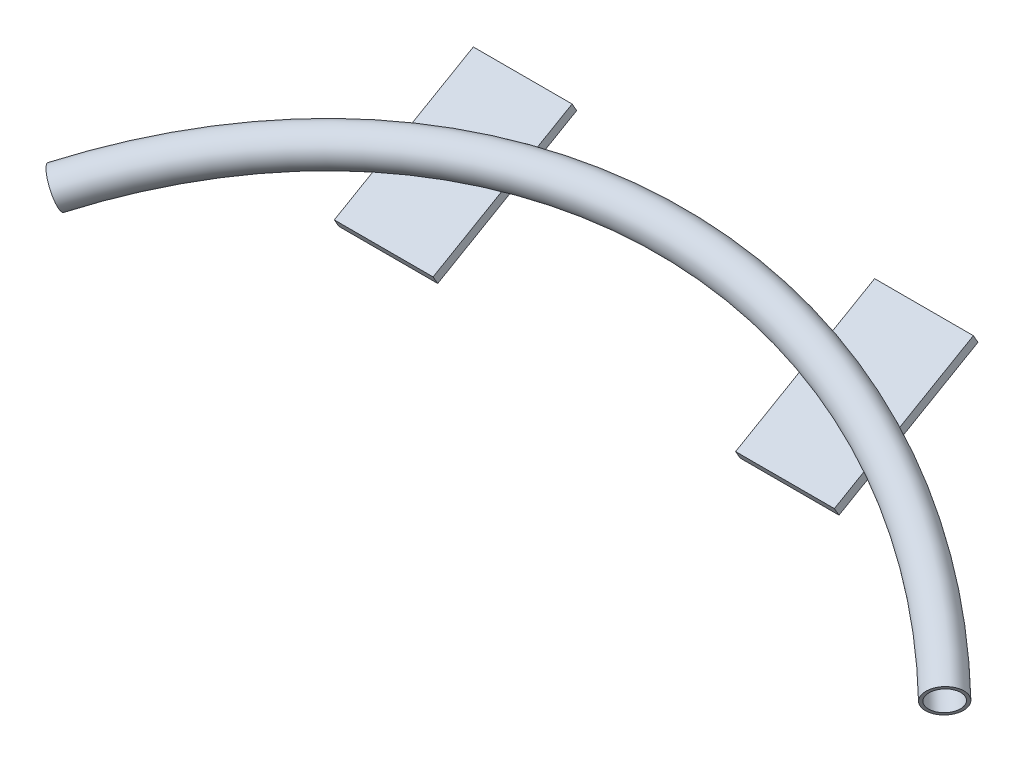
ISO-10303-21;
HEADER;
FILE_DESCRIPTION(('STEP AP214'),'2;1');
FILE_NAME('part.step','',(''),(''),'','','');
FILE_SCHEMA(('AUTOMOTIVE_DESIGN { 1 0 10303 214 1 1 1 1 }'));
ENDSEC;
DATA;
#1=APPLICATION_CONTEXT('core data for automotive mechanical design processes');
#2=APPLICATION_PROTOCOL_DEFINITION('international standard','automotive_design',2000,#1);
#3=PRODUCT_CONTEXT('',#1,'mechanical');
#4=PRODUCT('Part','Part','',(#3));
#5=PRODUCT_RELATED_PRODUCT_CATEGORY('part','',(#4));
#6=PRODUCT_DEFINITION_FORMATION('','',#4);
#7=PRODUCT_DEFINITION_CONTEXT('part definition',#1,'design');
#8=PRODUCT_DEFINITION('design','',#6,#7);
#9=PRODUCT_DEFINITION_SHAPE('','',#8);
#10=(LENGTH_UNIT() NAMED_UNIT(*) SI_UNIT(.MILLI.,.METRE.));
#11=(NAMED_UNIT(*) PLANE_ANGLE_UNIT() SI_UNIT($,.RADIAN.));
#12=(NAMED_UNIT(*) SI_UNIT($,.STERADIAN.) SOLID_ANGLE_UNIT());
#13=UNCERTAINTY_MEASURE_WITH_UNIT(LENGTH_MEASURE(1.E-05),#10,'distance_accuracy_value','');
#14=(GEOMETRIC_REPRESENTATION_CONTEXT(3) GLOBAL_UNCERTAINTY_ASSIGNED_CONTEXT((#13)) GLOBAL_UNIT_ASSIGNED_CONTEXT((#10,
#11,#12)) REPRESENTATION_CONTEXT('',''));
#15=CARTESIAN_POINT('',(0.,0.,0.));
#16=DIRECTION('',(0.,0.,1.));
#17=DIRECTION('',(1.,0.,0.));
#18=AXIS2_PLACEMENT_3D('',#15,#16,#17);
#19=CARTESIAN_POINT('',(155.575,19.7033240868596,-91.2771583964365));
#20=DIRECTION('',(1.,0.,0.));
#21=DIRECTION('',(0.,0.,-1.));
#22=AXIS2_PLACEMENT_3D('',#19,#20,#21);
#23=PLANE('',#22);
#24=DIRECTION('',(0.,0.5,-0.866025403784439));
#25=VECTOR('',#24,1.);
#26=CARTESIAN_POINT('',(155.575,27.9522160579064,-86.5146583964365));
#27=LINE('',#26,#25);
#28=CARTESIAN_POINT('',(155.575,27.9522160579064,-86.5146583964365));
#29=VERTEX_POINT('',#28);
#30=CARTESIAN_POINT('',(155.575,110.502216057906,-229.495452561247));
#31=VERTEX_POINT('',#30);
#32=EDGE_CURVE('E81',#29,#31,#27,.T.);
#33=ORIENTED_EDGE('',*,*,#32,.T.);
#34=DIRECTION('',(0.,0.866025403784439,0.5));
#35=VECTOR('',#34,1.);
#36=CARTESIAN_POINT('',(155.575,102.25332408686,-234.257952561247));
#37=LINE('',#36,#35);
#38=CARTESIAN_POINT('',(155.575,102.25332408686,-234.257952561247));
#39=VERTEX_POINT('',#38);
#40=EDGE_CURVE('E12',#39,#31,#37,.T.);
#41=ORIENTED_EDGE('',*,*,#40,.F.);
#42=DIRECTION('',(0.,0.5,-0.866025403784439));
#43=VECTOR('',#42,1.);
#44=CARTESIAN_POINT('',(155.575,19.7033240868596,-91.2771583964365));
#45=LINE('',#44,#43);
#46=CARTESIAN_POINT('',(155.575,19.7033240868596,-91.2771583964365));
#47=VERTEX_POINT('',#46);
#48=EDGE_CURVE('E99',#47,#39,#45,.T.);
#49=ORIENTED_EDGE('',*,*,#48,.F.);
#50=DIRECTION('',(0.,0.866025403784439,0.5));
#51=VECTOR('',#50,1.);
#52=CARTESIAN_POINT('',(155.575,19.7033240868596,-91.2771583964365));
#53=LINE('',#52,#51);
#54=EDGE_CURVE('E93',#47,#29,#53,.T.);
#55=ORIENTED_EDGE('',*,*,#54,.T.);
#56=EDGE_LOOP('',(#33,#41,#49,#55));
#57=FACE_BOUND('',#56,.T.);
#58=ADVANCED_FACE('F37',(#57),#23,.F.);
#59=CARTESIAN_POINT('',(155.575,102.25332408686,-234.257952561247));
#60=DIRECTION('',(0.,-0.5,0.866025403784439));
#61=DIRECTION('',(0.,-0.866025403784439,-0.5));
#62=AXIS2_PLACEMENT_3D('',#59,#60,#61);
#63=PLANE('',#62);
#64=DIRECTION('',(1.,0.,0.));
#65=VECTOR('',#64,1.);
#66=CARTESIAN_POINT('',(155.575,110.502216057906,-229.495452561247));
#67=LINE('',#66,#65);
#68=CARTESIAN_POINT('',(257.175,110.502216057906,-229.495452561247));
#69=VERTEX_POINT('',#68);
#70=EDGE_CURVE('E77',#31,#69,#67,.T.);
#71=ORIENTED_EDGE('',*,*,#70,.T.);
#72=DIRECTION('',(0.,0.866025403784439,0.5));
#73=VECTOR('',#72,1.);
#74=CARTESIAN_POINT('',(257.175,102.25332408686,-234.257952561247));
#75=LINE('',#74,#73);
#76=CARTESIAN_POINT('',(257.175,102.25332408686,-234.257952561247));
#77=VERTEX_POINT('',#76);
#78=EDGE_CURVE('E44',#77,#69,#75,.T.);
#79=ORIENTED_EDGE('',*,*,#78,.F.);
#80=DIRECTION('',(1.,0.,0.));
#81=VECTOR('',#80,1.);
#82=CARTESIAN_POINT('',(155.575,102.25332408686,-234.257952561247));
#83=LINE('',#82,#81);
#84=EDGE_CURVE('E89',#39,#77,#83,.T.);
#85=ORIENTED_EDGE('',*,*,#84,.F.);
#86=ORIENTED_EDGE('',*,*,#40,.T.);
#87=EDGE_LOOP('',(#71,#79,#85,#86));
#88=FACE_BOUND('',#87,.T.);
#89=ADVANCED_FACE('F88',(#88),#63,.F.);
#90=CARTESIAN_POINT('',(257.175,19.7033240868596,-91.2771583964365));
#91=DIRECTION('',(-1.,0.,0.));
#92=DIRECTION('',(0.,0.,1.));
#93=AXIS2_PLACEMENT_3D('',#90,#91,#92);
#94=PLANE('',#93);
#95=DIRECTION('',(0.,-0.5,0.866025403784439));
#96=VECTOR('',#95,1.);
#97=CARTESIAN_POINT('',(257.175,27.9522160579064,-86.5146583964365));
#98=LINE('',#97,#96);
#99=CARTESIAN_POINT('',(257.175,27.9522160579064,-86.5146583964365));
#100=VERTEX_POINT('',#99);
#101=EDGE_CURVE('E82',#69,#100,#98,.T.);
#102=ORIENTED_EDGE('',*,*,#101,.T.);
#103=DIRECTION('',(0.,0.866025403784439,0.5));
#104=VECTOR('',#103,1.);
#105=CARTESIAN_POINT('',(257.175,19.7033240868596,-91.2771583964365));
#106=LINE('',#105,#104);
#107=CARTESIAN_POINT('',(257.175,19.7033240868596,-91.2771583964365));
#108=VERTEX_POINT('',#107);
#109=EDGE_CURVE('E105',#108,#100,#106,.T.);
#110=ORIENTED_EDGE('',*,*,#109,.F.);
#111=DIRECTION('',(0.,-0.5,0.866025403784439));
#112=VECTOR('',#111,1.);
#113=CARTESIAN_POINT('',(257.175,19.7033240868596,-91.2771583964365));
#114=LINE('',#113,#112);
#115=EDGE_CURVE('E56',#77,#108,#114,.T.);
#116=ORIENTED_EDGE('',*,*,#115,.F.);
#117=ORIENTED_EDGE('',*,*,#78,.T.);
#118=EDGE_LOOP('',(#102,#110,#116,#117));
#119=FACE_BOUND('',#118,.T.);
#120=ADVANCED_FACE('F108',(#119),#94,.F.);
#121=CARTESIAN_POINT('',(155.575,19.7033240868596,-91.2771583964365));
#122=DIRECTION('',(0.,0.5,-0.866025403784439));
#123=DIRECTION('',(0.,0.866025403784439,0.5));
#124=AXIS2_PLACEMENT_3D('',#121,#122,#123);
#125=PLANE('',#124);
#126=DIRECTION('',(-1.,0.,0.));
#127=VECTOR('',#126,1.);
#128=CARTESIAN_POINT('',(155.575,27.9522160579064,-86.5146583964365));
#129=LINE('',#128,#127);
#130=EDGE_CURVE('E97',#100,#29,#129,.T.);
#131=ORIENTED_EDGE('',*,*,#130,.T.);
#132=ORIENTED_EDGE('',*,*,#54,.F.);
#133=DIRECTION('',(-1.,0.,0.));
#134=VECTOR('',#133,1.);
#135=CARTESIAN_POINT('',(155.575,19.7033240868596,-91.2771583964365));
#136=LINE('',#135,#134);
#137=EDGE_CURVE('E51',#108,#47,#136,.T.);
#138=ORIENTED_EDGE('',*,*,#137,.F.);
#139=ORIENTED_EDGE('',*,*,#109,.T.);
#140=EDGE_LOOP('',(#131,#132,#138,#139));
#141=FACE_BOUND('',#140,.T.);
#142=ADVANCED_FACE('F110',(#141),#125,.F.);
#143=CARTESIAN_POINT('',(155.575,19.7033240868596,-91.2771583964365));
#144=DIRECTION('',(0.,-0.866025403784439,-0.5));
#145=DIRECTION('',(0.,0.5,-0.866025403784439));
#146=AXIS2_PLACEMENT_3D('',#143,#144,#145);
#147=PLANE('',#146);
#148=ORIENTED_EDGE('',*,*,#48,.T.);
#149=ORIENTED_EDGE('',*,*,#84,.T.);
#150=ORIENTED_EDGE('',*,*,#115,.T.);
#151=ORIENTED_EDGE('',*,*,#137,.T.);
#152=EDGE_LOOP('',(#148,#149,#150,#151));
#153=FACE_BOUND('',#152,.T.);
#154=ADVANCED_FACE('F111',(#153),#147,.T.);
#155=CARTESIAN_POINT('',(155.575,27.9522160579064,-86.5146583964365));
#156=DIRECTION('',(0.,-0.866025403784439,-0.5));
#157=DIRECTION('',(0.,0.5,-0.866025403784439));
#158=AXIS2_PLACEMENT_3D('',#155,#156,#157);
#159=PLANE('',#158);
#160=ORIENTED_EDGE('',*,*,#32,.F.);
#161=ORIENTED_EDGE('',*,*,#130,.F.);
#162=ORIENTED_EDGE('',*,*,#101,.F.);
#163=ORIENTED_EDGE('',*,*,#70,.F.);
#164=EDGE_LOOP('',(#160,#161,#162,#163));
#165=FACE_BOUND('',#164,.T.);
#166=ADVANCED_FACE('F78',(#165),#159,.F.);
#167=CLOSED_SHELL('',(#58,#89,#120,#142,#154,#166));
#168=MANIFOLD_SOLID_BREP('B2',#167);
#169=CARTESIAN_POINT('',(-257.175,19.7033240868596,-91.2771583964366));
#170=DIRECTION('',(1.,0.,0.));
#171=DIRECTION('',(0.,1.,0.));
#172=AXIS2_PLACEMENT_3D('',#169,#170,#171);
#173=PLANE('',#172);
#174=DIRECTION('',(0.,0.5,-0.866025403784439));
#175=VECTOR('',#174,1.);
#176=CARTESIAN_POINT('',(-257.175,27.9522160579064,-86.5146583964366));
#177=LINE('',#176,#175);
#178=CARTESIAN_POINT('',(-257.175,27.9522160579064,-86.5146583964366));
#179=VERTEX_POINT('',#178);
#180=CARTESIAN_POINT('',(-257.175,110.502216057906,-229.495452561247));
#181=VERTEX_POINT('',#180);
#182=EDGE_CURVE('E199',#179,#181,#177,.T.);
#183=ORIENTED_EDGE('',*,*,#182,.T.);
#184=DIRECTION('',(0.,0.866025403784439,0.5));
#185=VECTOR('',#184,1.);
#186=CARTESIAN_POINT('',(-257.175,102.25332408686,-234.257952561247));
#187=LINE('',#186,#185);
#188=CARTESIAN_POINT('',(-257.175,102.25332408686,-234.257952561247));
#189=VERTEX_POINT('',#188);
#190=EDGE_CURVE('E35',#189,#181,#187,.T.);
#191=ORIENTED_EDGE('',*,*,#190,.F.);
#192=DIRECTION('',(0.,0.5,-0.866025403784439));
#193=VECTOR('',#192,1.);
#194=CARTESIAN_POINT('',(-257.175,19.7033240868596,-91.2771583964366));
#195=LINE('',#194,#193);
#196=CARTESIAN_POINT('',(-257.175,19.7033240868596,-91.2771583964366));
#197=VERTEX_POINT('',#196);
#198=EDGE_CURVE('E217',#197,#189,#195,.T.);
#199=ORIENTED_EDGE('',*,*,#198,.F.);
#200=DIRECTION('',(0.,0.866025403784439,0.5));
#201=VECTOR('',#200,1.);
#202=CARTESIAN_POINT('',(-257.175,19.7033240868596,-91.2771583964366));
#203=LINE('',#202,#201);
#204=EDGE_CURVE('E211',#197,#179,#203,.T.);
#205=ORIENTED_EDGE('',*,*,#204,.T.);
#206=EDGE_LOOP('',(#183,#191,#199,#205));
#207=FACE_BOUND('',#206,.T.);
#208=ADVANCED_FACE('F155',(#207),#173,.F.);
#209=CARTESIAN_POINT('',(-257.175,102.25332408686,-234.257952561247));
#210=DIRECTION('',(0.,-0.5,0.866025403784439));
#211=DIRECTION('',(0.,-0.866025403784439,-0.5));
#212=AXIS2_PLACEMENT_3D('',#209,#210,#211);
#213=PLANE('',#212);
#214=DIRECTION('',(1.,0.,0.));
#215=VECTOR('',#214,1.);
#216=CARTESIAN_POINT('',(-257.175,110.502216057906,-229.495452561247));
#217=LINE('',#216,#215);
#218=CARTESIAN_POINT('',(-155.575,110.502216057906,-229.495452561247));
#219=VERTEX_POINT('',#218);
#220=EDGE_CURVE('E195',#181,#219,#217,.T.);
#221=ORIENTED_EDGE('',*,*,#220,.T.);
#222=DIRECTION('',(0.,0.866025403784439,0.5));
#223=VECTOR('',#222,1.);
#224=CARTESIAN_POINT('',(-155.575,102.25332408686,-234.257952561247));
#225=LINE('',#224,#223);
#226=CARTESIAN_POINT('',(-155.575,102.25332408686,-234.257952561247));
#227=VERTEX_POINT('',#226);
#228=EDGE_CURVE('E162',#227,#219,#225,.T.);
#229=ORIENTED_EDGE('',*,*,#228,.F.);
#230=DIRECTION('',(1.,0.,0.));
#231=VECTOR('',#230,1.);
#232=CARTESIAN_POINT('',(-257.175,102.25332408686,-234.257952561247));
#233=LINE('',#232,#231);
#234=EDGE_CURVE('E207',#189,#227,#233,.T.);
#235=ORIENTED_EDGE('',*,*,#234,.F.);
#236=ORIENTED_EDGE('',*,*,#190,.T.);
#237=EDGE_LOOP('',(#221,#229,#235,#236));
#238=FACE_BOUND('',#237,.T.);
#239=ADVANCED_FACE('F206',(#238),#213,.F.);
#240=CARTESIAN_POINT('',(-155.575,19.7033240868596,-91.2771583964366));
#241=DIRECTION('',(-1.,0.,0.));
#242=DIRECTION('',(0.,0.,1.));
#243=AXIS2_PLACEMENT_3D('',#240,#241,#242);
#244=PLANE('',#243);
#245=DIRECTION('',(0.,-0.5,0.866025403784439));
#246=VECTOR('',#245,1.);
#247=CARTESIAN_POINT('',(-155.575,27.9522160579064,-86.5146583964366));
#248=LINE('',#247,#246);
#249=CARTESIAN_POINT('',(-155.575,27.9522160579064,-86.5146583964366));
#250=VERTEX_POINT('',#249);
#251=EDGE_CURVE('E200',#219,#250,#248,.T.);
#252=ORIENTED_EDGE('',*,*,#251,.T.);
#253=DIRECTION('',(0.,0.866025403784439,0.5));
#254=VECTOR('',#253,1.);
#255=CARTESIAN_POINT('',(-155.575,19.7033240868596,-91.2771583964366));
#256=LINE('',#255,#254);
#257=CARTESIAN_POINT('',(-155.575,19.7033240868596,-91.2771583964366));
#258=VERTEX_POINT('',#257);
#259=EDGE_CURVE('E223',#258,#250,#256,.T.);
#260=ORIENTED_EDGE('',*,*,#259,.F.);
#261=DIRECTION('',(0.,-0.5,0.866025403784439));
#262=VECTOR('',#261,1.);
#263=CARTESIAN_POINT('',(-155.575,19.7033240868596,-91.2771583964366));
#264=LINE('',#263,#262);
#265=EDGE_CURVE('E174',#227,#258,#264,.T.);
#266=ORIENTED_EDGE('',*,*,#265,.F.);
#267=ORIENTED_EDGE('',*,*,#228,.T.);
#268=EDGE_LOOP('',(#252,#260,#266,#267));
#269=FACE_BOUND('',#268,.T.);
#270=ADVANCED_FACE('F226',(#269),#244,.F.);
#271=CARTESIAN_POINT('',(-257.175,19.7033240868596,-91.2771583964366));
#272=DIRECTION('',(0.,0.5,-0.866025403784439));
#273=DIRECTION('',(0.,0.866025403784439,0.5));
#274=AXIS2_PLACEMENT_3D('',#271,#272,#273);
#275=PLANE('',#274);
#276=DIRECTION('',(-1.,0.,0.));
#277=VECTOR('',#276,1.);
#278=CARTESIAN_POINT('',(-257.175,27.9522160579064,-86.5146583964366));
#279=LINE('',#278,#277);
#280=EDGE_CURVE('E215',#250,#179,#279,.T.);
#281=ORIENTED_EDGE('',*,*,#280,.T.);
#282=ORIENTED_EDGE('',*,*,#204,.F.);
#283=DIRECTION('',(-1.,0.,0.));
#284=VECTOR('',#283,1.);
#285=CARTESIAN_POINT('',(-257.175,19.7033240868596,-91.2771583964366));
#286=LINE('',#285,#284);
#287=EDGE_CURVE('E169',#258,#197,#286,.T.);
#288=ORIENTED_EDGE('',*,*,#287,.F.);
#289=ORIENTED_EDGE('',*,*,#259,.T.);
#290=EDGE_LOOP('',(#281,#282,#288,#289));
#291=FACE_BOUND('',#290,.T.);
#292=ADVANCED_FACE('F228',(#291),#275,.F.);
#293=CARTESIAN_POINT('',(-257.175,102.25332408686,-234.257952561247));
#294=DIRECTION('',(0.,-0.866025403784439,-0.5));
#295=DIRECTION('',(0.,0.5,-0.866025403784439));
#296=AXIS2_PLACEMENT_3D('',#293,#294,#295);
#297=PLANE('',#296);
#298=ORIENTED_EDGE('',*,*,#198,.T.);
#299=ORIENTED_EDGE('',*,*,#234,.T.);
#300=ORIENTED_EDGE('',*,*,#265,.T.);
#301=ORIENTED_EDGE('',*,*,#287,.T.);
#302=EDGE_LOOP('',(#298,#299,#300,#301));
#303=FACE_BOUND('',#302,.T.);
#304=ADVANCED_FACE('F229',(#303),#297,.T.);
#305=CARTESIAN_POINT('',(-257.175,110.502216057906,-229.495452561247));
#306=DIRECTION('',(0.,-0.866025403784439,-0.5));
#307=DIRECTION('',(0.,0.5,-0.866025403784439));
#308=AXIS2_PLACEMENT_3D('',#305,#306,#307);
#309=PLANE('',#308);
#310=ORIENTED_EDGE('',*,*,#182,.F.);
#311=ORIENTED_EDGE('',*,*,#280,.F.);
#312=ORIENTED_EDGE('',*,*,#251,.F.);
#313=ORIENTED_EDGE('',*,*,#220,.F.);
#314=EDGE_LOOP('',(#310,#311,#312,#313));
#315=FACE_BOUND('',#314,.T.);
#316=ADVANCED_FACE('F196',(#315),#309,.F.);
#317=CLOSED_SHELL('',(#208,#239,#270,#292,#304,#316));
#318=MANIFOLD_SOLID_BREP('B6',#317);
#319=CARTESIAN_POINT('',(0.,-206.375,357.451985412027));
#320=DIRECTION('',(0.,-0.866025403784439,-0.5));
#321=DIRECTION('',(0.,0.5,-0.866025403784439));
#322=AXIS2_PLACEMENT_3D('',#319,#320,#321);
#323=TOROIDAL_SURFACE('',#322,615.95,15.875);
#324=CARTESIAN_POINT('',(-457.2,0.,0.));
#325=DIRECTION('',(0.670103092783505,0.371134020618557,-0.642822980128656));
#326=DIRECTION('',(-0.692265024427321,0.,-0.721643357867749));
#327=AXIS2_PLACEMENT_3D('',#324,#325,#326);
#328=CIRCLE('',#327,15.875);
#329=CARTESIAN_POINT('',(-468.983505154639,5.31894329896901,-9.21268003639236));
#330=VERTEX_POINT('',#329);
#331=EDGE_CURVE('E273',#330,#330,#328,.T.);
#332=CARTESIAN_POINT('',(457.2,0.,0.));
#333=DIRECTION('',(0.670103092783505,-0.371134020618557,0.642822980128656));
#334=DIRECTION('',(0.692265024427321,0.,-0.721643357867749));
#335=AXIS2_PLACEMENT_3D('',#332,#333,#334);
#336=CIRCLE('',#335,15.875);
#337=CARTESIAN_POINT('',(468.983505154639,5.31894329896912,-9.21268003639253));
#338=VERTEX_POINT('',#337);
#339=EDGE_CURVE('E281',#338,#338,#336,.T.);
#340=CARTESIAN_POINT('',(0.,-206.375,357.451985412027));
#341=DIRECTION('',(0.,-0.866025403784439,-0.5));
#342=DIRECTION('',(0.,0.5,-0.866025403784439));
#343=AXIS2_PLACEMENT_3D('',#340,#341,#342);
#344=CIRCLE('',#343,631.825);
#345=EDGE_CURVE('',#330,#338,#344,.T.);
#346=ORIENTED_EDGE('',*,*,#331,.F.);
#347=ORIENTED_EDGE('',*,*,#339,.T.);
#348=ORIENTED_EDGE('',*,*,#345,.T.);
#349=ORIENTED_EDGE('',*,*,#345,.F.);
#350=EDGE_LOOP('',(#346,#348,#347,#349));
#351=FACE_BOUND('',#350,.T.);
#352=ADVANCED_FACE('F266',(#351),#323,.F.);
#353=CARTESIAN_POINT('',(0.,-206.375,357.451985412027));
#354=DIRECTION('',(0.,-0.866025403784439,-0.5));
#355=DIRECTION('',(0.,0.5,-0.866025403784439));
#356=AXIS2_PLACEMENT_3D('',#353,#354,#355);
#357=TOROIDAL_SURFACE('',#356,615.95,19.05);
#358=CARTESIAN_POINT('',(-457.2,0.,0.));
#359=DIRECTION('',(0.670103092783505,0.371134020618557,-0.642822980128656));
#360=DIRECTION('',(-0.692265024427321,0.,-0.721643357867749));
#361=AXIS2_PLACEMENT_3D('',#358,#359,#360);
#362=CIRCLE('',#361,19.05);
#363=CARTESIAN_POINT('',(-471.340206185567,6.38273195876285,-11.0552160436709));
#364=VERTEX_POINT('',#363);
#365=EDGE_CURVE('E154',#364,#364,#362,.T.);
#366=CARTESIAN_POINT('',(457.2,0.,0.));
#367=DIRECTION('',(0.670103092783505,-0.371134020618557,0.642822980128656));
#368=DIRECTION('',(0.692265024427321,0.,-0.721643357867749));
#369=AXIS2_PLACEMENT_3D('',#366,#367,#368);
#370=CIRCLE('',#369,19.05);
#371=CARTESIAN_POINT('',(471.340206185567,6.38273195876293,-11.055216043671));
#372=VERTEX_POINT('',#371);
#373=EDGE_CURVE('E277',#372,#372,#370,.T.);
#374=CARTESIAN_POINT('',(0.,-206.375,357.451985412027));
#375=DIRECTION('',(0.,-0.866025403784439,-0.5));
#376=DIRECTION('',(0.,0.5,-0.866025403784439));
#377=AXIS2_PLACEMENT_3D('',#374,#375,#376);
#378=CIRCLE('',#377,635.);
#379=EDGE_CURVE('',#364,#372,#378,.T.);
#380=ORIENTED_EDGE('',*,*,#365,.T.);
#381=ORIENTED_EDGE('',*,*,#373,.F.);
#382=ORIENTED_EDGE('',*,*,#379,.T.);
#383=ORIENTED_EDGE('',*,*,#379,.F.);
#384=EDGE_LOOP('',(#380,#382,#381,#383));
#385=FACE_BOUND('',#384,.T.);
#386=ADVANCED_FACE('F268',(#385),#357,.T.);
#387=CARTESIAN_POINT('',(-457.2,0.,0.));
#388=DIRECTION('',(0.670103092783505,0.371134020618557,-0.642822980128656));
#389=DIRECTION('',(-0.692265024427321,0.,-0.721643357867749));
#390=AXIS2_PLACEMENT_3D('',#387,#388,#389);
#391=PLANE('',#390);
#392=ORIENTED_EDGE('',*,*,#331,.T.);
#393=EDGE_LOOP('',(#392));
#394=FACE_BOUND('',#393,.T.);
#395=ORIENTED_EDGE('',*,*,#365,.F.);
#396=EDGE_LOOP('',(#395));
#397=FACE_BOUND('',#396,.T.);
#398=ADVANCED_FACE('F291',(#394,#397),#391,.F.);
#399=CARTESIAN_POINT('',(457.2,0.,0.));
#400=DIRECTION('',(0.670103092783505,-0.371134020618557,0.642822980128656));
#401=DIRECTION('',(0.692265024427321,0.,-0.721643357867749));
#402=AXIS2_PLACEMENT_3D('',#399,#400,#401);
#403=PLANE('',#402);
#404=ORIENTED_EDGE('',*,*,#339,.F.);
#405=EDGE_LOOP('',(#404));
#406=FACE_BOUND('',#405,.T.);
#407=ORIENTED_EDGE('',*,*,#373,.T.);
#408=EDGE_LOOP('',(#407));
#409=FACE_BOUND('',#408,.T.);
#410=ADVANCED_FACE('F288',(#406,#409),#403,.T.);
#411=CLOSED_SHELL('',(#352,#386,#398,#410));
#412=MANIFOLD_SOLID_BREP('B29',#411);
#413=ADVANCED_BREP_SHAPE_REPRESENTATION('',(#18,#168,#318,#412),#14);
#414=SHAPE_DEFINITION_REPRESENTATION(#9,#413);
ENDSEC;
END-ISO-10303-21;
